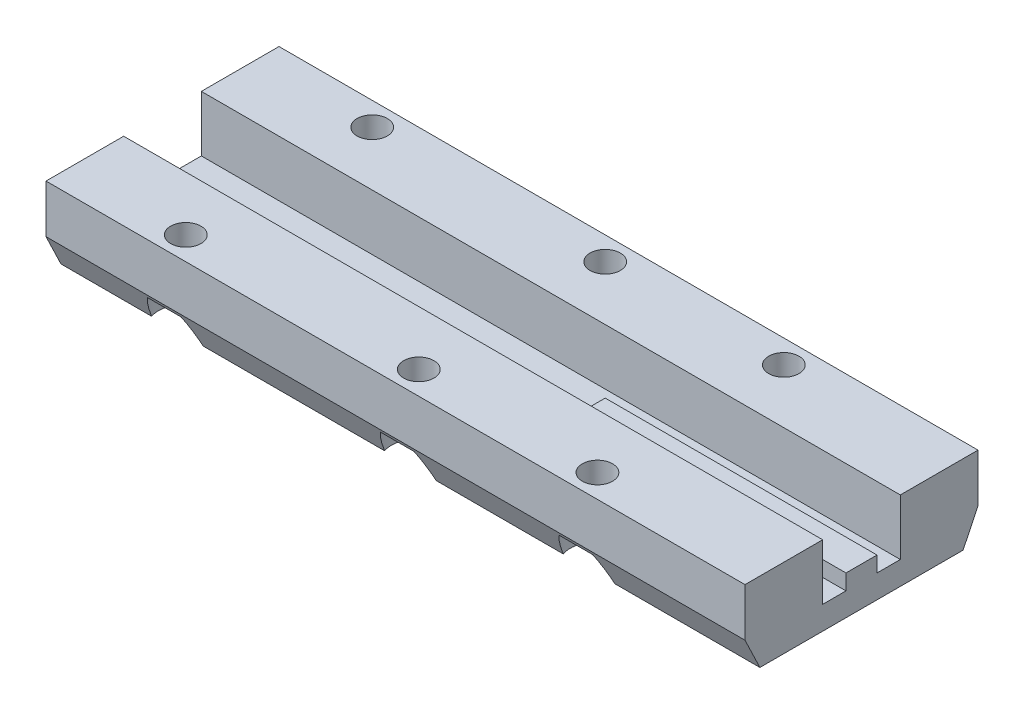
ISO-10303-21;
HEADER;
FILE_DESCRIPTION(('STEP AP214'),'2;1');
FILE_NAME('part.step','',(''),(''),'','','');
FILE_SCHEMA(('AUTOMOTIVE_DESIGN { 1 0 10303 214 1 1 1 1 }'));
ENDSEC;
DATA;
#1=APPLICATION_CONTEXT('core data for automotive mechanical design processes');
#2=APPLICATION_PROTOCOL_DEFINITION('international standard','automotive_design',2000,#1);
#3=PRODUCT_CONTEXT('',#1,'mechanical');
#4=PRODUCT('Part','Part','',(#3));
#5=PRODUCT_RELATED_PRODUCT_CATEGORY('part','',(#4));
#6=PRODUCT_DEFINITION_FORMATION('','',#4);
#7=PRODUCT_DEFINITION_CONTEXT('part definition',#1,'design');
#8=PRODUCT_DEFINITION('design','',#6,#7);
#9=PRODUCT_DEFINITION_SHAPE('','',#8);
#10=(LENGTH_UNIT() NAMED_UNIT(*) SI_UNIT(.MILLI.,.METRE.));
#11=(NAMED_UNIT(*) PLANE_ANGLE_UNIT() SI_UNIT($,.RADIAN.));
#12=(NAMED_UNIT(*) SI_UNIT($,.STERADIAN.) SOLID_ANGLE_UNIT());
#13=UNCERTAINTY_MEASURE_WITH_UNIT(LENGTH_MEASURE(1.E-05),#10,'distance_accuracy_value','');
#14=(GEOMETRIC_REPRESENTATION_CONTEXT(3) GLOBAL_UNCERTAINTY_ASSIGNED_CONTEXT((#13)) GLOBAL_UNIT_ASSIGNED_CONTEXT((#10,
#11,#12)) REPRESENTATION_CONTEXT('',''));
#15=CARTESIAN_POINT('',(0.,0.,0.));
#16=DIRECTION('',(0.,0.,1.));
#17=DIRECTION('',(1.,0.,0.));
#18=AXIS2_PLACEMENT_3D('',#15,#16,#17);
#19=CARTESIAN_POINT('',(15.,0.,12.));
#20=DIRECTION('',(0.,-1.,0.));
#21=DIRECTION('',(0.,0.,-1.));
#22=AXIS2_PLACEMENT_3D('',#19,#20,#21);
#23=CYLINDRICAL_SURFACE('',#22,1.95);
#24=CARTESIAN_POINT('',(15.,0.,12.));
#25=DIRECTION('',(0.,-1.,0.));
#26=DIRECTION('',(0.,0.,-1.));
#27=AXIS2_PLACEMENT_3D('',#24,#25,#26);
#28=CIRCLE('',#27,1.95);
#29=CARTESIAN_POINT('',(15.,0.,10.05));
#30=VERTEX_POINT('',#29);
#31=EDGE_CURVE('E439',#30,#30,#28,.T.);
#32=ORIENTED_EDGE('',*,*,#31,.F.);
#33=EDGE_LOOP('',(#32));
#34=FACE_BOUND('',#33,.T.);
#35=CARTESIAN_POINT('',(15.,-6.7,12.));
#36=DIRECTION('',(0.,-1.,0.));
#37=DIRECTION('',(0.,0.,-1.));
#38=AXIS2_PLACEMENT_3D('',#35,#36,#37);
#39=CIRCLE('',#38,1.95);
#40=CARTESIAN_POINT('',(15.,-6.7,10.05));
#41=VERTEX_POINT('',#40);
#42=EDGE_CURVE('E398',#41,#41,#39,.F.);
#43=ORIENTED_EDGE('',*,*,#42,.F.);
#44=EDGE_LOOP('',(#43));
#45=FACE_BOUND('',#44,.T.);
#46=ADVANCED_FACE('F33',(#34,#45),#23,.F.);
#47=CARTESIAN_POINT('',(68.,0.,12.));
#48=DIRECTION('',(0.,-1.,0.));
#49=DIRECTION('',(0.,0.,-1.));
#50=AXIS2_PLACEMENT_3D('',#47,#48,#49);
#51=CYLINDRICAL_SURFACE('',#50,1.95);
#52=CARTESIAN_POINT('',(68.,0.,12.));
#53=DIRECTION('',(0.,-1.,0.));
#54=DIRECTION('',(0.,0.,-1.));
#55=AXIS2_PLACEMENT_3D('',#52,#53,#54);
#56=CIRCLE('',#55,1.95);
#57=CARTESIAN_POINT('',(68.,0.,10.05));
#58=VERTEX_POINT('',#57);
#59=EDGE_CURVE('E443',#58,#58,#56,.T.);
#60=ORIENTED_EDGE('',*,*,#59,.F.);
#61=EDGE_LOOP('',(#60));
#62=FACE_BOUND('',#61,.T.);
#63=CARTESIAN_POINT('',(68.,-6.7,12.));
#64=DIRECTION('',(0.,-1.,0.));
#65=DIRECTION('',(0.,0.,-1.));
#66=AXIS2_PLACEMENT_3D('',#63,#64,#65);
#67=CIRCLE('',#66,1.95);
#68=CARTESIAN_POINT('',(68.,-6.7,10.05));
#69=VERTEX_POINT('',#68);
#70=EDGE_CURVE('E392',#69,#69,#67,.F.);
#71=ORIENTED_EDGE('',*,*,#70,.F.);
#72=EDGE_LOOP('',(#71));
#73=FACE_BOUND('',#72,.T.);
#74=ADVANCED_FACE('F566',(#62,#73),#51,.F.);
#75=CARTESIAN_POINT('',(45.,0.,12.));
#76=DIRECTION('',(0.,-1.,0.));
#77=DIRECTION('',(0.,0.,-1.));
#78=AXIS2_PLACEMENT_3D('',#75,#76,#77);
#79=CYLINDRICAL_SURFACE('',#78,1.95);
#80=CARTESIAN_POINT('',(45.,0.,12.));
#81=DIRECTION('',(0.,-1.,0.));
#82=DIRECTION('',(0.,0.,-1.));
#83=AXIS2_PLACEMENT_3D('',#80,#81,#82);
#84=CIRCLE('',#83,1.95);
#85=CARTESIAN_POINT('',(45.,0.,10.05));
#86=VERTEX_POINT('',#85);
#87=EDGE_CURVE('E446',#86,#86,#84,.T.);
#88=ORIENTED_EDGE('',*,*,#87,.F.);
#89=EDGE_LOOP('',(#88));
#90=FACE_BOUND('',#89,.T.);
#91=CARTESIAN_POINT('',(45.,-6.7,12.));
#92=DIRECTION('',(0.,-1.,0.));
#93=DIRECTION('',(0.,0.,-1.));
#94=AXIS2_PLACEMENT_3D('',#91,#92,#93);
#95=CIRCLE('',#94,1.95);
#96=CARTESIAN_POINT('',(45.,-6.7,10.05));
#97=VERTEX_POINT('',#96);
#98=EDGE_CURVE('E384',#97,#97,#95,.F.);
#99=ORIENTED_EDGE('',*,*,#98,.F.);
#100=EDGE_LOOP('',(#99));
#101=FACE_BOUND('',#100,.T.);
#102=ADVANCED_FACE('F572',(#90,#101),#79,.F.);
#103=CARTESIAN_POINT('',(68.,0.,-12.));
#104=DIRECTION('',(0.,-1.,0.));
#105=DIRECTION('',(0.,0.,-1.));
#106=AXIS2_PLACEMENT_3D('',#103,#104,#105);
#107=CYLINDRICAL_SURFACE('',#106,1.95);
#108=CARTESIAN_POINT('',(68.,0.,-12.));
#109=DIRECTION('',(0.,-1.,0.));
#110=DIRECTION('',(0.,0.,-1.));
#111=AXIS2_PLACEMENT_3D('',#108,#109,#110);
#112=CIRCLE('',#111,1.95);
#113=CARTESIAN_POINT('',(68.,0.,-13.95));
#114=VERTEX_POINT('',#113);
#115=EDGE_CURVE('E301',#114,#114,#112,.F.);
#116=ORIENTED_EDGE('',*,*,#115,.T.);
#117=EDGE_LOOP('',(#116));
#118=FACE_BOUND('',#117,.T.);
#119=CARTESIAN_POINT('',(68.,-6.7,-12.));
#120=DIRECTION('',(0.,-1.,0.));
#121=DIRECTION('',(0.,0.,-1.));
#122=AXIS2_PLACEMENT_3D('',#119,#120,#121);
#123=CIRCLE('',#122,1.95);
#124=CARTESIAN_POINT('',(68.,-6.7,-13.95));
#125=VERTEX_POINT('',#124);
#126=EDGE_CURVE('E379',#125,#125,#123,.T.);
#127=ORIENTED_EDGE('',*,*,#126,.T.);
#128=EDGE_LOOP('',(#127));
#129=FACE_BOUND('',#128,.T.);
#130=ADVANCED_FACE('F583',(#118,#129),#107,.F.);
#131=CARTESIAN_POINT('',(45.,0.,-12.));
#132=DIRECTION('',(0.,-1.,0.));
#133=DIRECTION('',(0.,0.,-1.));
#134=AXIS2_PLACEMENT_3D('',#131,#132,#133);
#135=CYLINDRICAL_SURFACE('',#134,1.95);
#136=CARTESIAN_POINT('',(45.,0.,-12.));
#137=DIRECTION('',(0.,-1.,0.));
#138=DIRECTION('',(0.,0.,-1.));
#139=AXIS2_PLACEMENT_3D('',#136,#137,#138);
#140=CIRCLE('',#139,1.95);
#141=CARTESIAN_POINT('',(45.,0.,-13.95));
#142=VERTEX_POINT('',#141);
#143=EDGE_CURVE('E305',#142,#142,#140,.F.);
#144=ORIENTED_EDGE('',*,*,#143,.T.);
#145=EDGE_LOOP('',(#144));
#146=FACE_BOUND('',#145,.T.);
#147=CARTESIAN_POINT('',(45.,-6.7,-12.));
#148=DIRECTION('',(0.,-1.,0.));
#149=DIRECTION('',(0.,0.,-1.));
#150=AXIS2_PLACEMENT_3D('',#147,#148,#149);
#151=CIRCLE('',#150,1.95);
#152=CARTESIAN_POINT('',(45.,-6.7,-13.95));
#153=VERTEX_POINT('',#152);
#154=EDGE_CURVE('E374',#153,#153,#151,.T.);
#155=ORIENTED_EDGE('',*,*,#154,.T.);
#156=EDGE_LOOP('',(#155));
#157=FACE_BOUND('',#156,.T.);
#158=ADVANCED_FACE('F619',(#146,#157),#135,.F.);
#159=CARTESIAN_POINT('',(15.,0.,-12.));
#160=DIRECTION('',(0.,-1.,0.));
#161=DIRECTION('',(0.,0.,-1.));
#162=AXIS2_PLACEMENT_3D('',#159,#160,#161);
#163=CYLINDRICAL_SURFACE('',#162,1.95);
#164=CARTESIAN_POINT('',(15.,0.,-12.));
#165=DIRECTION('',(0.,-1.,0.));
#166=DIRECTION('',(0.,0.,-1.));
#167=AXIS2_PLACEMENT_3D('',#164,#165,#166);
#168=CIRCLE('',#167,1.95);
#169=CARTESIAN_POINT('',(15.,0.,-13.95));
#170=VERTEX_POINT('',#169);
#171=EDGE_CURVE('E300',#170,#170,#168,.F.);
#172=ORIENTED_EDGE('',*,*,#171,.T.);
#173=EDGE_LOOP('',(#172));
#174=FACE_BOUND('',#173,.T.);
#175=CARTESIAN_POINT('',(15.,-6.7,-12.));
#176=DIRECTION('',(0.,-1.,0.));
#177=DIRECTION('',(0.,0.,-1.));
#178=AXIS2_PLACEMENT_3D('',#175,#176,#177);
#179=CIRCLE('',#178,1.95);
#180=CARTESIAN_POINT('',(15.,-6.7,-13.95));
#181=VERTEX_POINT('',#180);
#182=EDGE_CURVE('E369',#181,#181,#179,.T.);
#183=ORIENTED_EDGE('',*,*,#182,.T.);
#184=EDGE_LOOP('',(#183));
#185=FACE_BOUND('',#184,.T.);
#186=ADVANCED_FACE('F616',(#174,#185),#163,.F.);
#187=CARTESIAN_POINT('',(55.,-5.2,2.));
#188=DIRECTION('',(1.,0.,0.));
#189=DIRECTION('',(0.,0.,-1.));
#190=AXIS2_PLACEMENT_3D('',#187,#188,#189);
#191=PLANE('',#190);
#192=DIRECTION('',(0.,-1.,0.));
#193=VECTOR('',#192,1.);
#194=CARTESIAN_POINT('',(55.,-5.2,1.95));
#195=LINE('',#194,#193);
#196=CARTESIAN_POINT('',(55.,-7.2,1.95));
#197=VERTEX_POINT('',#196);
#198=CARTESIAN_POINT('',(55.,-10.2,1.95));
#199=VERTEX_POINT('',#198);
#200=EDGE_CURVE('E365',#197,#199,#195,.T.);
#201=ORIENTED_EDGE('',*,*,#200,.F.);
#202=DIRECTION('',(0.,0.,-1.));
#203=VECTOR('',#202,1.);
#204=CARTESIAN_POINT('',(55.,-7.2,2.));
#205=LINE('',#204,#203);
#206=CARTESIAN_POINT('',(55.,-7.2,2.));
#207=VERTEX_POINT('',#206);
#208=EDGE_CURVE('E266',#207,#197,#205,.T.);
#209=ORIENTED_EDGE('',*,*,#208,.F.);
#210=DIRECTION('',(0.,-1.,0.));
#211=VECTOR('',#210,1.);
#212=CARTESIAN_POINT('',(55.,-5.2,2.));
#213=LINE('',#212,#211);
#214=CARTESIAN_POINT('',(55.,-5.2,2.));
#215=VERTEX_POINT('',#214);
#216=EDGE_CURVE('E272',#215,#207,#213,.T.);
#217=ORIENTED_EDGE('',*,*,#216,.F.);
#218=DIRECTION('',(0.,0.,-1.));
#219=VECTOR('',#218,1.);
#220=CARTESIAN_POINT('',(55.,-5.2,2.));
#221=LINE('',#220,#219);
#222=CARTESIAN_POINT('',(55.,-5.2,-2.));
#223=VERTEX_POINT('',#222);
#224=EDGE_CURVE('E280',#215,#223,#221,.T.);
#225=ORIENTED_EDGE('',*,*,#224,.T.);
#226=DIRECTION('',(0.,-1.,0.));
#227=VECTOR('',#226,1.);
#228=CARTESIAN_POINT('',(55.,-5.2,-2.));
#229=LINE('',#228,#227);
#230=CARTESIAN_POINT('',(55.,-7.2,-2.));
#231=VERTEX_POINT('',#230);
#232=EDGE_CURVE('E271',#223,#231,#229,.T.);
#233=ORIENTED_EDGE('',*,*,#232,.T.);
#234=DIRECTION('',(0.,0.,1.));
#235=VECTOR('',#234,1.);
#236=CARTESIAN_POINT('',(55.,-7.2,-5.));
#237=LINE('',#236,#235);
#238=CARTESIAN_POINT('',(55.,-7.2,-1.95));
#239=VERTEX_POINT('',#238);
#240=EDGE_CURVE('E298',#231,#239,#237,.T.);
#241=ORIENTED_EDGE('',*,*,#240,.T.);
#242=DIRECTION('',(0.,-1.,0.));
#243=VECTOR('',#242,1.);
#244=CARTESIAN_POINT('',(55.,-7.2,-1.95));
#245=LINE('',#244,#243);
#246=CARTESIAN_POINT('',(55.,-10.2,-1.95));
#247=VERTEX_POINT('',#246);
#248=EDGE_CURVE('E295',#239,#247,#245,.T.);
#249=ORIENTED_EDGE('',*,*,#248,.T.);
#250=DIRECTION('',(0.,0.,-1.));
#251=VECTOR('',#250,1.);
#252=CARTESIAN_POINT('',(55.,-10.2,2.));
#253=LINE('',#252,#251);
#254=EDGE_CURVE('E291',#199,#247,#253,.T.);
#255=ORIENTED_EDGE('',*,*,#254,.F.);
#256=EDGE_LOOP('',(#201,#209,#217,#225,#233,#241,#249,#255));
#257=FACE_BOUND('',#256,.T.);
#258=ADVANCED_FACE('F515',(#257),#191,.F.);
#259=CARTESIAN_POINT('',(0.,0.,2.));
#260=DIRECTION('',(0.,0.,1.));
#261=DIRECTION('',(1.,0.,0.));
#262=AXIS2_PLACEMENT_3D('',#259,#260,#261);
#263=PLANE('',#262);
#264=ORIENTED_EDGE('',*,*,#216,.T.);
#265=DIRECTION('',(1.,0.,0.));
#266=VECTOR('',#265,1.);
#267=CARTESIAN_POINT('',(0.,-7.2,2.));
#268=LINE('',#267,#266);
#269=CARTESIAN_POINT('',(90.,-7.2,2.));
#270=VERTEX_POINT('',#269);
#271=EDGE_CURVE('E362',#207,#270,#268,.T.);
#272=ORIENTED_EDGE('',*,*,#271,.T.);
#273=DIRECTION('',(0.,1.,0.));
#274=VECTOR('',#273,1.);
#275=CARTESIAN_POINT('',(90.,-5.2,2.));
#276=LINE('',#275,#274);
#277=CARTESIAN_POINT('',(90.,-5.2,2.));
#278=VERTEX_POINT('',#277);
#279=EDGE_CURVE('E275',#270,#278,#276,.T.);
#280=ORIENTED_EDGE('',*,*,#279,.T.);
#281=DIRECTION('',(-1.,0.,0.));
#282=VECTOR('',#281,1.);
#283=CARTESIAN_POINT('',(55.,-5.2,2.));
#284=LINE('',#283,#282);
#285=EDGE_CURVE('E278',#278,#215,#284,.T.);
#286=ORIENTED_EDGE('',*,*,#285,.T.);
#287=EDGE_LOOP('',(#264,#272,#280,#286));
#288=FACE_BOUND('',#287,.T.);
#289=ADVANCED_FACE('F510',(#288),#263,.T.);
#290=CARTESIAN_POINT('',(90.,-7.2,-5.));
#291=DIRECTION('',(0.,-1.,0.));
#292=DIRECTION('',(0.,0.,-1.));
#293=AXIS2_PLACEMENT_3D('',#290,#291,#292);
#294=PLANE('',#293);
#295=ORIENTED_EDGE('',*,*,#240,.F.);
#296=DIRECTION('',(-1.,0.,0.));
#297=VECTOR('',#296,1.);
#298=CARTESIAN_POINT('',(90.,-7.2,-2.));
#299=LINE('',#298,#297);
#300=CARTESIAN_POINT('',(90.,-7.2,-2.));
#301=VERTEX_POINT('',#300);
#302=EDGE_CURVE('E293',#301,#231,#299,.T.);
#303=ORIENTED_EDGE('',*,*,#302,.F.);
#304=DIRECTION('',(0.,0.,1.));
#305=VECTOR('',#304,1.);
#306=CARTESIAN_POINT('',(90.,-7.2,-5.));
#307=LINE('',#306,#305);
#308=CARTESIAN_POINT('',(90.,-7.2,-5.));
#309=VERTEX_POINT('',#308);
#310=EDGE_CURVE('E318',#309,#301,#307,.T.);
#311=ORIENTED_EDGE('',*,*,#310,.F.);
#312=DIRECTION('',(-1.,0.,0.));
#313=VECTOR('',#312,1.);
#314=CARTESIAN_POINT('',(90.,-7.2,-5.));
#315=LINE('',#314,#313);
#316=CARTESIAN_POINT('',(0.,-7.2,-5.));
#317=VERTEX_POINT('',#316);
#318=EDGE_CURVE('E353',#309,#317,#315,.T.);
#319=ORIENTED_EDGE('',*,*,#318,.T.);
#320=DIRECTION('',(0.,0.,1.));
#321=VECTOR('',#320,1.);
#322=CARTESIAN_POINT('',(0.,-7.2,-5.));
#323=LINE('',#322,#321);
#324=CARTESIAN_POINT('',(0.,-7.2,-1.95));
#325=VERTEX_POINT('',#324);
#326=EDGE_CURVE('E332',#317,#325,#323,.T.);
#327=ORIENTED_EDGE('',*,*,#326,.T.);
#328=DIRECTION('',(-1.,0.,0.));
#329=VECTOR('',#328,1.);
#330=CARTESIAN_POINT('',(90.,-7.2,-1.95));
#331=LINE('',#330,#329);
#332=EDGE_CURVE('E351',#239,#325,#331,.T.);
#333=ORIENTED_EDGE('',*,*,#332,.F.);
#334=EDGE_LOOP('',(#295,#303,#311,#319,#327,#333));
#335=FACE_BOUND('',#334,.T.);
#336=ADVANCED_FACE('F606',(#335),#294,.F.);
#337=CARTESIAN_POINT('',(90.,-7.2,-1.95));
#338=DIRECTION('',(0.,0.,-1.));
#339=DIRECTION('',(0.,1.,0.));
#340=AXIS2_PLACEMENT_3D('',#337,#338,#339);
#341=PLANE('',#340);
#342=ORIENTED_EDGE('',*,*,#248,.F.);
#343=ORIENTED_EDGE('',*,*,#332,.T.);
#344=DIRECTION('',(0.,-1.,0.));
#345=VECTOR('',#344,1.);
#346=CARTESIAN_POINT('',(0.,-7.2,-1.95));
#347=LINE('',#346,#345);
#348=CARTESIAN_POINT('',(0.,-10.2,-1.95));
#349=VERTEX_POINT('',#348);
#350=EDGE_CURVE('E335',#325,#349,#347,.T.);
#351=ORIENTED_EDGE('',*,*,#350,.T.);
#352=DIRECTION('',(-1.,0.,0.));
#353=VECTOR('',#352,1.);
#354=CARTESIAN_POINT('',(90.,-10.2,-1.95));
#355=LINE('',#354,#353);
#356=EDGE_CURVE('E348',#247,#349,#355,.T.);
#357=ORIENTED_EDGE('',*,*,#356,.F.);
#358=EDGE_LOOP('',(#342,#343,#351,#357));
#359=FACE_BOUND('',#358,.T.);
#360=ADVANCED_FACE('F524',(#359),#341,.F.);
#361=CARTESIAN_POINT('',(90.,-10.2,-13.0811365520714));
#362=DIRECTION('',(0.,0.432522842970461,0.901622975699239));
#363=DIRECTION('',(0.,-0.901622975699239,0.432522842970461));
#364=AXIS2_PLACEMENT_3D('',#361,#362,#363);
#365=PLANE('',#364);
#366=DIRECTION('',(-1.,0.,0.));
#367=VECTOR('',#366,1.);
#368=CARTESIAN_POINT('',(90.,-10.2,-13.0811365520714));
#369=LINE('',#368,#367);
#370=CARTESIAN_POINT('',(90.,-10.2,-13.0811365520714));
#371=VERTEX_POINT('',#370);
#372=CARTESIAN_POINT('',(71.3288351950457,-10.2,-13.0811365520714));
#373=VERTEX_POINT('',#372);
#374=EDGE_CURVE('E345',#371,#373,#369,.T.);
#375=ORIENTED_EDGE('',*,*,#374,.T.);
#376=CARTESIAN_POINT('',(68.,-12.4537019051325,-12.));
#377=DIRECTION('',(0.,0.432522842970461,0.901622975699239));
#378=DIRECTION('',(0.,-0.901622975699239,0.432522842970461));
#379=AXIS2_PLACEMENT_3D('',#376,#377,#378);
#380=ELLIPSE('',#379,8.09205815804516,3.50000000000001);
#381=CARTESIAN_POINT('',(70.1521188998025,-6.7,-14.7601420690089));
#382=VERTEX_POINT('',#381);
#383=EDGE_CURVE('E420',#373,#382,#380,.T.);
#384=ORIENTED_EDGE('',*,*,#383,.T.);
#385=DIRECTION('',(1.,0.,0.));
#386=VECTOR('',#385,1.);
#387=CARTESIAN_POINT('',(90.,-6.7,-14.7601420690089));
#388=LINE('',#387,#386);
#389=CARTESIAN_POINT('',(65.8478811001975,-6.7,-14.7601420690089));
#390=VERTEX_POINT('',#389);
#391=EDGE_CURVE('E382',#390,#382,#388,.T.);
#392=ORIENTED_EDGE('',*,*,#391,.F.);
#393=CARTESIAN_POINT('',(64.6711648049543,-10.2,-13.0811365520714));
#394=VERTEX_POINT('',#393);
#395=EDGE_CURVE('E417',#390,#394,#380,.T.);
#396=ORIENTED_EDGE('',*,*,#395,.T.);
#397=CARTESIAN_POINT('',(48.3288351950457,-10.2,-13.0811365520714));
#398=VERTEX_POINT('',#397);
#399=EDGE_CURVE('E349',#394,#398,#369,.T.);
#400=ORIENTED_EDGE('',*,*,#399,.T.);
#401=CARTESIAN_POINT('',(45.,-12.4537019051325,-12.));
#402=DIRECTION('',(0.,0.432522842970461,0.901622975699239));
#403=DIRECTION('',(0.,-0.901622975699239,0.432522842970461));
#404=AXIS2_PLACEMENT_3D('',#401,#402,#403);
#405=ELLIPSE('',#404,8.09205815804514,3.5);
#406=CARTESIAN_POINT('',(47.1521188998025,-6.7,-14.7601420690089));
#407=VERTEX_POINT('',#406);
#408=EDGE_CURVE('E429',#398,#407,#405,.T.);
#409=ORIENTED_EDGE('',*,*,#408,.T.);
#410=DIRECTION('',(1.,0.,0.));
#411=VECTOR('',#410,1.);
#412=CARTESIAN_POINT('',(90.,-6.7,-14.7601420690089));
#413=LINE('',#412,#411);
#414=CARTESIAN_POINT('',(42.8478811001975,-6.7,-14.7601420690089));
#415=VERTEX_POINT('',#414);
#416=EDGE_CURVE('E377',#415,#407,#413,.T.);
#417=ORIENTED_EDGE('',*,*,#416,.F.);
#418=CARTESIAN_POINT('',(41.6711648049543,-10.2,-13.0811365520714));
#419=VERTEX_POINT('',#418);
#420=EDGE_CURVE('E426',#415,#419,#405,.T.);
#421=ORIENTED_EDGE('',*,*,#420,.T.);
#422=CARTESIAN_POINT('',(18.3288351950457,-10.2,-13.0811365520714));
#423=VERTEX_POINT('',#422);
#424=EDGE_CURVE('E676',#419,#423,#369,.T.);
#425=ORIENTED_EDGE('',*,*,#424,.T.);
#426=CARTESIAN_POINT('',(15.,-12.4537019051325,-12.));
#427=DIRECTION('',(0.,0.432522842970461,0.901622975699239));
#428=DIRECTION('',(0.,-0.901622975699239,0.432522842970461));
#429=AXIS2_PLACEMENT_3D('',#426,#427,#428);
#430=ELLIPSE('',#429,8.09205815804514,3.5);
#431=CARTESIAN_POINT('',(17.1521188998025,-6.7,-14.7601420690089));
#432=VERTEX_POINT('',#431);
#433=EDGE_CURVE('E438',#423,#432,#430,.T.);
#434=ORIENTED_EDGE('',*,*,#433,.T.);
#435=DIRECTION('',(1.,0.,0.));
#436=VECTOR('',#435,1.);
#437=CARTESIAN_POINT('',(90.,-6.7,-14.7601420690089));
#438=LINE('',#437,#436);
#439=CARTESIAN_POINT('',(12.8478811001975,-6.7,-14.7601420690089));
#440=VERTEX_POINT('',#439);
#441=EDGE_CURVE('E372',#440,#432,#438,.T.);
#442=ORIENTED_EDGE('',*,*,#441,.F.);
#443=CARTESIAN_POINT('',(11.6711648049543,-10.2,-13.0811365520714));
#444=VERTEX_POINT('',#443);
#445=EDGE_CURVE('E435',#440,#444,#430,.T.);
#446=ORIENTED_EDGE('',*,*,#445,.T.);
#447=CARTESIAN_POINT('',(0.,-10.2,-13.0811365520714));
#448=VERTEX_POINT('',#447);
#449=EDGE_CURVE('E344',#444,#448,#369,.T.);
#450=ORIENTED_EDGE('',*,*,#449,.T.);
#451=DIRECTION('',(0.,0.901622975699239,-0.432522842970461));
#452=VECTOR('',#451,1.);
#453=CARTESIAN_POINT('',(0.,-10.2,-13.0811365520714));
#454=LINE('',#453,#452);
#455=CARTESIAN_POINT('',(0.,-6.2,-15.));
#456=VERTEX_POINT('',#455);
#457=EDGE_CURVE('E314',#448,#456,#454,.T.);
#458=ORIENTED_EDGE('',*,*,#457,.T.);
#459=DIRECTION('',(-1.,0.,0.));
#460=VECTOR('',#459,1.);
#461=CARTESIAN_POINT('',(90.,-6.2,-15.));
#462=LINE('',#461,#460);
#463=CARTESIAN_POINT('',(90.,-6.2,-15.));
#464=VERTEX_POINT('',#463);
#465=EDGE_CURVE('E325',#464,#456,#462,.T.);
#466=ORIENTED_EDGE('',*,*,#465,.F.);
#467=DIRECTION('',(0.,0.901622975699239,-0.432522842970461));
#468=VECTOR('',#467,1.);
#469=CARTESIAN_POINT('',(90.,-10.2,-13.0811365520714));
#470=LINE('',#469,#468);
#471=EDGE_CURVE('E323',#371,#464,#470,.T.);
#472=ORIENTED_EDGE('',*,*,#471,.F.);
#473=EDGE_LOOP('',(#375,#384,#392,#396,#400,#409,#417,#421,#425,#434,#442,#446,#450,#458,#466,#472));
#474=FACE_BOUND('',#473,.T.);
#475=ADVANCED_FACE('F532',(#474),#365,.F.);
#476=CARTESIAN_POINT('',(90.,0.,-15.));
#477=DIRECTION('',(0.,0.,1.));
#478=DIRECTION('',(1.,0.,0.));
#479=AXIS2_PLACEMENT_3D('',#476,#477,#478);
#480=PLANE('',#479);
#481=DIRECTION('',(0.,1.,0.));
#482=VECTOR('',#481,1.);
#483=CARTESIAN_POINT('',(0.,0.,-15.));
#484=LINE('',#483,#482);
#485=CARTESIAN_POINT('',(0.,0.,-15.));
#486=VERTEX_POINT('',#485);
#487=EDGE_CURVE('E304',#456,#486,#484,.T.);
#488=ORIENTED_EDGE('',*,*,#487,.T.);
#489=DIRECTION('',(-1.,0.,0.));
#490=VECTOR('',#489,1.);
#491=CARTESIAN_POINT('',(90.,0.,-15.));
#492=LINE('',#491,#490);
#493=CARTESIAN_POINT('',(90.,0.,-15.));
#494=VERTEX_POINT('',#493);
#495=EDGE_CURVE('E359',#494,#486,#492,.T.);
#496=ORIENTED_EDGE('',*,*,#495,.F.);
#497=DIRECTION('',(0.,1.,0.));
#498=VECTOR('',#497,1.);
#499=CARTESIAN_POINT('',(90.,0.,-15.));
#500=LINE('',#499,#498);
#501=EDGE_CURVE('E310',#464,#494,#500,.T.);
#502=ORIENTED_EDGE('',*,*,#501,.F.);
#503=ORIENTED_EDGE('',*,*,#465,.T.);
#504=EDGE_LOOP('',(#488,#496,#502,#503));
#505=FACE_BOUND('',#504,.T.);
#506=ADVANCED_FACE('F35',(#505),#480,.F.);
#507=CARTESIAN_POINT('',(90.,0.,-15.));
#508=DIRECTION('',(0.,-1.,0.));
#509=DIRECTION('',(0.,0.,-1.));
#510=AXIS2_PLACEMENT_3D('',#507,#508,#509);
#511=PLANE('',#510);
#512=ORIENTED_EDGE('',*,*,#115,.F.);
#513=EDGE_LOOP('',(#512));
#514=FACE_BOUND('',#513,.T.);
#515=ORIENTED_EDGE('',*,*,#143,.F.);
#516=EDGE_LOOP('',(#515));
#517=FACE_BOUND('',#516,.T.);
#518=ORIENTED_EDGE('',*,*,#171,.F.);
#519=EDGE_LOOP('',(#518));
#520=FACE_BOUND('',#519,.T.);
#521=DIRECTION('',(0.,0.,1.));
#522=VECTOR('',#521,1.);
#523=CARTESIAN_POINT('',(0.,0.,-15.));
#524=LINE('',#523,#522);
#525=CARTESIAN_POINT('',(0.,0.,-5.));
#526=VERTEX_POINT('',#525);
#527=EDGE_CURVE('E328',#486,#526,#524,.T.);
#528=ORIENTED_EDGE('',*,*,#527,.T.);
#529=DIRECTION('',(-1.,0.,0.));
#530=VECTOR('',#529,1.);
#531=CARTESIAN_POINT('',(90.,0.,-5.));
#532=LINE('',#531,#530);
#533=CARTESIAN_POINT('',(90.,0.,-5.));
#534=VERTEX_POINT('',#533);
#535=EDGE_CURVE('E356',#534,#526,#532,.T.);
#536=ORIENTED_EDGE('',*,*,#535,.F.);
#537=DIRECTION('',(0.,0.,1.));
#538=VECTOR('',#537,1.);
#539=CARTESIAN_POINT('',(90.,0.,-15.));
#540=LINE('',#539,#538);
#541=EDGE_CURVE('E313',#494,#534,#540,.T.);
#542=ORIENTED_EDGE('',*,*,#541,.F.);
#543=ORIENTED_EDGE('',*,*,#495,.T.);
#544=EDGE_LOOP('',(#528,#536,#542,#543));
#545=FACE_BOUND('',#544,.T.);
#546=ADVANCED_FACE('F642',(#514,#517,#520,#545),#511,.F.);
#547=CARTESIAN_POINT('',(90.,0.,-5.));
#548=DIRECTION('',(0.,0.,-1.));
#549=DIRECTION('',(0.,1.,0.));
#550=AXIS2_PLACEMENT_3D('',#547,#548,#549);
#551=PLANE('',#550);
#552=DIRECTION('',(0.,-1.,0.));
#553=VECTOR('',#552,1.);
#554=CARTESIAN_POINT('',(0.,0.,-5.));
#555=LINE('',#554,#553);
#556=EDGE_CURVE('E330',#526,#317,#555,.T.);
#557=ORIENTED_EDGE('',*,*,#556,.T.);
#558=ORIENTED_EDGE('',*,*,#318,.F.);
#559=DIRECTION('',(0.,-1.,0.));
#560=VECTOR('',#559,1.);
#561=CARTESIAN_POINT('',(90.,0.,-5.));
#562=LINE('',#561,#560);
#563=EDGE_CURVE('E316',#534,#309,#562,.T.);
#564=ORIENTED_EDGE('',*,*,#563,.F.);
#565=ORIENTED_EDGE('',*,*,#535,.T.);
#566=EDGE_LOOP('',(#557,#558,#564,#565));
#567=FACE_BOUND('',#566,.T.);
#568=ADVANCED_FACE('F635',(#567),#551,.F.);
#569=CARTESIAN_POINT('',(90.,-10.2,-1.95));
#570=DIRECTION('',(0.,1.,0.));
#571=DIRECTION('',(0.,0.,1.));
#572=AXIS2_PLACEMENT_3D('',#569,#570,#571);
#573=PLANE('',#572);
#574=DIRECTION('',(-1.,0.,0.));
#575=VECTOR('',#574,1.);
#576=CARTESIAN_POINT('',(90.,-10.2,13.0811365520714));
#577=LINE('',#576,#575);
#578=CARTESIAN_POINT('',(41.6711648049543,-10.2,13.0811365520714));
#579=VERTEX_POINT('',#578);
#580=CARTESIAN_POINT('',(18.3288351950457,-10.2,13.0811365520714));
#581=VERTEX_POINT('',#580);
#582=EDGE_CURVE('E241',#579,#581,#577,.T.);
#583=ORIENTED_EDGE('',*,*,#582,.T.);
#584=CARTESIAN_POINT('',(15.,-10.2,12.));
#585=DIRECTION('',(0.,-1.,0.));
#586=DIRECTION('',(0.,0.,-1.));
#587=AXIS2_PLACEMENT_3D('',#584,#585,#586);
#588=CIRCLE('',#587,3.5);
#589=CARTESIAN_POINT('',(11.6711648049543,-10.2,13.0811365520714));
#590=VERTEX_POINT('',#589);
#591=EDGE_CURVE('E229',#590,#581,#588,.T.);
#592=ORIENTED_EDGE('',*,*,#591,.F.);
#593=CARTESIAN_POINT('',(0.,-10.2,13.0811365520714));
#594=VERTEX_POINT('',#593);
#595=EDGE_CURVE('E249',#590,#594,#577,.T.);
#596=ORIENTED_EDGE('',*,*,#595,.T.);
#597=DIRECTION('',(0.,0.,-1.));
#598=VECTOR('',#597,1.);
#599=CARTESIAN_POINT('',(0.,-10.2,1.95));
#600=LINE('',#599,#598);
#601=CARTESIAN_POINT('',(0.,-10.2,1.95));
#602=VERTEX_POINT('',#601);
#603=EDGE_CURVE('E469',#594,#602,#600,.T.);
#604=ORIENTED_EDGE('',*,*,#603,.T.);
#605=DIRECTION('',(-1.,0.,0.));
#606=VECTOR('',#605,1.);
#607=CARTESIAN_POINT('',(90.,-10.2,1.95));
#608=LINE('',#607,#606);
#609=EDGE_CURVE('E252',#199,#602,#608,.T.);
#610=ORIENTED_EDGE('',*,*,#609,.F.);
#611=ORIENTED_EDGE('',*,*,#254,.T.);
#612=ORIENTED_EDGE('',*,*,#356,.T.);
#613=DIRECTION('',(0.,0.,-1.));
#614=VECTOR('',#613,1.);
#615=CARTESIAN_POINT('',(0.,-10.2,-1.95));
#616=LINE('',#615,#614);
#617=EDGE_CURVE('E338',#349,#448,#616,.T.);
#618=ORIENTED_EDGE('',*,*,#617,.T.);
#619=ORIENTED_EDGE('',*,*,#449,.F.);
#620=CARTESIAN_POINT('',(15.,-10.2,-12.));
#621=DIRECTION('',(0.,-1.,0.));
#622=DIRECTION('',(0.,0.,-1.));
#623=AXIS2_PLACEMENT_3D('',#620,#621,#622);
#624=CIRCLE('',#623,3.5);
#625=EDGE_CURVE('E432',#423,#444,#624,.T.);
#626=ORIENTED_EDGE('',*,*,#625,.F.);
#627=ORIENTED_EDGE('',*,*,#424,.F.);
#628=CARTESIAN_POINT('',(45.,-10.2,-12.));
#629=DIRECTION('',(0.,-1.,0.));
#630=DIRECTION('',(0.,0.,-1.));
#631=AXIS2_PLACEMENT_3D('',#628,#629,#630);
#632=CIRCLE('',#631,3.5);
#633=EDGE_CURVE('E423',#398,#419,#632,.T.);
#634=ORIENTED_EDGE('',*,*,#633,.F.);
#635=ORIENTED_EDGE('',*,*,#399,.F.);
#636=CARTESIAN_POINT('',(68.,-10.2,-12.));
#637=DIRECTION('',(0.,-1.,0.));
#638=DIRECTION('',(0.,0.,-1.));
#639=AXIS2_PLACEMENT_3D('',#636,#637,#638);
#640=CIRCLE('',#639,3.50000000000001);
#641=EDGE_CURVE('E412',#373,#394,#640,.T.);
#642=ORIENTED_EDGE('',*,*,#641,.F.);
#643=ORIENTED_EDGE('',*,*,#374,.F.);
#644=DIRECTION('',(0.,0.,-1.));
#645=VECTOR('',#644,1.);
#646=CARTESIAN_POINT('',(90.,-10.2,-1.95));
#647=LINE('',#646,#645);
#648=CARTESIAN_POINT('',(90.,-10.2,13.0811365520714));
#649=VERTEX_POINT('',#648);
#650=EDGE_CURVE('E321',#649,#371,#647,.T.);
#651=ORIENTED_EDGE('',*,*,#650,.F.);
#652=CARTESIAN_POINT('',(71.3288351950457,-10.2,13.0811365520714));
#653=VERTEX_POINT('',#652);
#654=EDGE_CURVE('E251',#649,#653,#577,.T.);
#655=ORIENTED_EDGE('',*,*,#654,.T.);
#656=CARTESIAN_POINT('',(68.,-10.2,12.));
#657=DIRECTION('',(0.,-1.,0.));
#658=DIRECTION('',(0.,0.,-1.));
#659=AXIS2_PLACEMENT_3D('',#656,#657,#658);
#660=CIRCLE('',#659,3.50000000000001);
#661=CARTESIAN_POINT('',(64.6711648049543,-10.2,13.0811365520714));
#662=VERTEX_POINT('',#661);
#663=EDGE_CURVE('E402',#662,#653,#660,.T.);
#664=ORIENTED_EDGE('',*,*,#663,.F.);
#665=CARTESIAN_POINT('',(48.3288351950457,-10.2,13.0811365520714));
#666=VERTEX_POINT('',#665);
#667=EDGE_CURVE('E248',#662,#666,#577,.T.);
#668=ORIENTED_EDGE('',*,*,#667,.T.);
#669=CARTESIAN_POINT('',(45.,-10.2,12.));
#670=DIRECTION('',(0.,-1.,0.));
#671=DIRECTION('',(0.,0.,-1.));
#672=AXIS2_PLACEMENT_3D('',#669,#670,#671);
#673=CIRCLE('',#672,3.5);
#674=EDGE_CURVE('E247',#579,#666,#673,.T.);
#675=ORIENTED_EDGE('',*,*,#674,.F.);
#676=EDGE_LOOP('',(#583,#592,#596,#604,#610,#611,#612,#618,#619,#626,#627,#634,#635,#642,#643,
#651,#655,#664,#668,#675));
#677=FACE_BOUND('',#676,.T.);
#678=ADVANCED_FACE('F245',(#677),#573,.F.);
#679=CARTESIAN_POINT('',(90.,0.,0.));
#680=DIRECTION('',(1.,0.,0.));
#681=DIRECTION('',(0.,0.,-1.));
#682=AXIS2_PLACEMENT_3D('',#679,#680,#681);
#683=PLANE('',#682);
#684=ORIENTED_EDGE('',*,*,#650,.T.);
#685=ORIENTED_EDGE('',*,*,#471,.T.);
#686=ORIENTED_EDGE('',*,*,#501,.T.);
#687=ORIENTED_EDGE('',*,*,#541,.T.);
#688=ORIENTED_EDGE('',*,*,#563,.T.);
#689=ORIENTED_EDGE('',*,*,#310,.T.);
#690=DIRECTION('',(0.,1.,0.));
#691=VECTOR('',#690,1.);
#692=CARTESIAN_POINT('',(90.,-5.2,-2.));
#693=LINE('',#692,#691);
#694=CARTESIAN_POINT('',(90.,-5.2,-2.));
#695=VERTEX_POINT('',#694);
#696=EDGE_CURVE('E283',#301,#695,#693,.T.);
#697=ORIENTED_EDGE('',*,*,#696,.T.);
#698=DIRECTION('',(0.,0.,-1.));
#699=VECTOR('',#698,1.);
#700=CARTESIAN_POINT('',(90.,-5.2,2.));
#701=LINE('',#700,#699);
#702=EDGE_CURVE('E288',#278,#695,#701,.T.);
#703=ORIENTED_EDGE('',*,*,#702,.F.);
#704=ORIENTED_EDGE('',*,*,#279,.F.);
#705=DIRECTION('',(0.,0.,1.));
#706=VECTOR('',#705,1.);
#707=CARTESIAN_POINT('',(90.,-7.2,5.));
#708=LINE('',#707,#706);
#709=CARTESIAN_POINT('',(90.,-7.2,5.));
#710=VERTEX_POINT('',#709);
#711=EDGE_CURVE('E458',#270,#710,#708,.T.);
#712=ORIENTED_EDGE('',*,*,#711,.T.);
#713=DIRECTION('',(0.,1.,0.));
#714=VECTOR('',#713,1.);
#715=CARTESIAN_POINT('',(90.,0.,5.));
#716=LINE('',#715,#714);
#717=CARTESIAN_POINT('',(90.,0.,5.));
#718=VERTEX_POINT('',#717);
#719=EDGE_CURVE('E460',#710,#718,#716,.T.);
#720=ORIENTED_EDGE('',*,*,#719,.T.);
#721=DIRECTION('',(0.,0.,1.));
#722=VECTOR('',#721,1.);
#723=CARTESIAN_POINT('',(90.,0.,15.));
#724=LINE('',#723,#722);
#725=CARTESIAN_POINT('',(90.,0.,15.));
#726=VERTEX_POINT('',#725);
#727=EDGE_CURVE('E449',#718,#726,#724,.T.);
#728=ORIENTED_EDGE('',*,*,#727,.T.);
#729=DIRECTION('',(0.,-1.,0.));
#730=VECTOR('',#729,1.);
#731=CARTESIAN_POINT('',(90.,0.,15.));
#732=LINE('',#731,#730);
#733=CARTESIAN_POINT('',(90.,-6.2,15.));
#734=VERTEX_POINT('',#733);
#735=EDGE_CURVE('E452',#726,#734,#732,.T.);
#736=ORIENTED_EDGE('',*,*,#735,.T.);
#737=DIRECTION('',(0.,-0.901622975699238,-0.432522842970462));
#738=VECTOR('',#737,1.);
#739=CARTESIAN_POINT('',(90.,-10.2,13.0811365520714));
#740=LINE('',#739,#738);
#741=EDGE_CURVE('E455',#734,#649,#740,.T.);
#742=ORIENTED_EDGE('',*,*,#741,.T.);
#743=EDGE_LOOP('',(#684,#685,#686,#687,#688,#689,#697,#703,#704,#712,#720,#728,#736,#742));
#744=FACE_BOUND('',#743,.T.);
#745=ADVANCED_FACE('F506',(#744),#683,.T.);
#746=CARTESIAN_POINT('',(0.,0.,0.));
#747=DIRECTION('',(1.,0.,0.));
#748=DIRECTION('',(0.,0.,-1.));
#749=AXIS2_PLACEMENT_3D('',#746,#747,#748);
#750=PLANE('',#749);
#751=ORIENTED_EDGE('',*,*,#487,.F.);
#752=ORIENTED_EDGE('',*,*,#457,.F.);
#753=ORIENTED_EDGE('',*,*,#617,.F.);
#754=ORIENTED_EDGE('',*,*,#350,.F.);
#755=ORIENTED_EDGE('',*,*,#326,.F.);
#756=ORIENTED_EDGE('',*,*,#556,.F.);
#757=ORIENTED_EDGE('',*,*,#527,.F.);
#758=EDGE_LOOP('',(#751,#752,#753,#754,#755,#756,#757));
#759=FACE_BOUND('',#758,.T.);
#760=ADVANCED_FACE('F529',(#759),#750,.F.);
#761=CARTESIAN_POINT('',(0.,0.,-2.));
#762=DIRECTION('',(0.,0.,1.));
#763=DIRECTION('',(1.,0.,0.));
#764=AXIS2_PLACEMENT_3D('',#761,#762,#763);
#765=PLANE('',#764);
#766=ORIENTED_EDGE('',*,*,#696,.F.);
#767=ORIENTED_EDGE('',*,*,#302,.T.);
#768=ORIENTED_EDGE('',*,*,#232,.F.);
#769=DIRECTION('',(-1.,0.,0.));
#770=VECTOR('',#769,1.);
#771=CARTESIAN_POINT('',(55.,-5.2,-2.));
#772=LINE('',#771,#770);
#773=EDGE_CURVE('E276',#695,#223,#772,.T.);
#774=ORIENTED_EDGE('',*,*,#773,.F.);
#775=EDGE_LOOP('',(#766,#767,#768,#774));
#776=FACE_BOUND('',#775,.T.);
#777=ADVANCED_FACE('F607',(#776),#765,.F.);
#778=CARTESIAN_POINT('',(55.,-5.2,2.));
#779=DIRECTION('',(0.,-1.,0.));
#780=DIRECTION('',(0.,0.,-1.));
#781=AXIS2_PLACEMENT_3D('',#778,#779,#780);
#782=PLANE('',#781);
#783=ORIENTED_EDGE('',*,*,#773,.T.);
#784=ORIENTED_EDGE('',*,*,#224,.F.);
#785=ORIENTED_EDGE('',*,*,#285,.F.);
#786=ORIENTED_EDGE('',*,*,#702,.T.);
#787=EDGE_LOOP('',(#783,#784,#785,#786));
#788=FACE_BOUND('',#787,.T.);
#789=ADVANCED_FACE('F594',(#788),#782,.F.);
#790=CARTESIAN_POINT('',(90.,-7.2,1.95));
#791=DIRECTION('',(0.,0.,1.));
#792=DIRECTION('',(0.,-1.,0.));
#793=AXIS2_PLACEMENT_3D('',#790,#791,#792);
#794=PLANE('',#793);
#795=DIRECTION('',(-1.,0.,0.));
#796=VECTOR('',#795,1.);
#797=CARTESIAN_POINT('',(90.,-7.2,1.95));
#798=LINE('',#797,#796);
#799=CARTESIAN_POINT('',(0.,-7.2,1.95));
#800=VERTEX_POINT('',#799);
#801=EDGE_CURVE('E483',#197,#800,#798,.T.);
#802=ORIENTED_EDGE('',*,*,#801,.F.);
#803=ORIENTED_EDGE('',*,*,#200,.T.);
#804=ORIENTED_EDGE('',*,*,#609,.T.);
#805=DIRECTION('',(0.,1.,0.));
#806=VECTOR('',#805,1.);
#807=CARTESIAN_POINT('',(0.,-7.2,1.95));
#808=LINE('',#807,#806);
#809=EDGE_CURVE('E472',#602,#800,#808,.T.);
#810=ORIENTED_EDGE('',*,*,#809,.T.);
#811=EDGE_LOOP('',(#802,#803,#804,#810));
#812=FACE_BOUND('',#811,.T.);
#813=ADVANCED_FACE('F487',(#812),#794,.F.);
#814=CARTESIAN_POINT('',(90.,-7.2,5.));
#815=DIRECTION('',(0.,-1.,0.));
#816=DIRECTION('',(0.,0.,-1.));
#817=AXIS2_PLACEMENT_3D('',#814,#815,#816);
#818=PLANE('',#817);
#819=ORIENTED_EDGE('',*,*,#271,.F.);
#820=ORIENTED_EDGE('',*,*,#208,.T.);
#821=ORIENTED_EDGE('',*,*,#801,.T.);
#822=DIRECTION('',(0.,0.,1.));
#823=VECTOR('',#822,1.);
#824=CARTESIAN_POINT('',(0.,-7.2,5.));
#825=LINE('',#824,#823);
#826=CARTESIAN_POINT('',(0.,-7.2,5.));
#827=VERTEX_POINT('',#826);
#828=EDGE_CURVE('E475',#800,#827,#825,.T.);
#829=ORIENTED_EDGE('',*,*,#828,.T.);
#830=DIRECTION('',(-1.,0.,0.));
#831=VECTOR('',#830,1.);
#832=CARTESIAN_POINT('',(90.,-7.2,5.));
#833=LINE('',#832,#831);
#834=EDGE_CURVE('E480',#710,#827,#833,.T.);
#835=ORIENTED_EDGE('',*,*,#834,.F.);
#836=ORIENTED_EDGE('',*,*,#711,.F.);
#837=EDGE_LOOP('',(#819,#820,#821,#829,#835,#836));
#838=FACE_BOUND('',#837,.T.);
#839=ADVANCED_FACE('F498',(#838),#818,.F.);
#840=CARTESIAN_POINT('',(90.,0.,15.));
#841=DIRECTION('',(0.,-1.,0.));
#842=DIRECTION('',(0.,0.,-1.));
#843=AXIS2_PLACEMENT_3D('',#840,#841,#842);
#844=PLANE('',#843);
#845=ORIENTED_EDGE('',*,*,#31,.T.);
#846=EDGE_LOOP('',(#845));
#847=FACE_BOUND('',#846,.T.);
#848=ORIENTED_EDGE('',*,*,#59,.T.);
#849=EDGE_LOOP('',(#848));
#850=FACE_BOUND('',#849,.T.);
#851=ORIENTED_EDGE('',*,*,#87,.T.);
#852=EDGE_LOOP('',(#851));
#853=FACE_BOUND('',#852,.T.);
#854=DIRECTION('',(0.,0.,1.));
#855=VECTOR('',#854,1.);
#856=CARTESIAN_POINT('',(0.,0.,15.));
#857=LINE('',#856,#855);
#858=CARTESIAN_POINT('',(0.,0.,5.));
#859=VERTEX_POINT('',#858);
#860=CARTESIAN_POINT('',(0.,0.,15.));
#861=VERTEX_POINT('',#860);
#862=EDGE_CURVE('E442',#859,#861,#857,.T.);
#863=ORIENTED_EDGE('',*,*,#862,.T.);
#864=DIRECTION('',(-1.,0.,0.));
#865=VECTOR('',#864,1.);
#866=CARTESIAN_POINT('',(90.,0.,15.));
#867=LINE('',#866,#865);
#868=EDGE_CURVE('E260',#726,#861,#867,.T.);
#869=ORIENTED_EDGE('',*,*,#868,.F.);
#870=ORIENTED_EDGE('',*,*,#727,.F.);
#871=DIRECTION('',(-1.,0.,0.));
#872=VECTOR('',#871,1.);
#873=CARTESIAN_POINT('',(90.,0.,5.));
#874=LINE('',#873,#872);
#875=EDGE_CURVE('E462',#718,#859,#874,.T.);
#876=ORIENTED_EDGE('',*,*,#875,.T.);
#877=EDGE_LOOP('',(#863,#869,#870,#876));
#878=FACE_BOUND('',#877,.T.);
#879=ADVANCED_FACE('F591',(#847,#850,#853,#878),#844,.F.);
#880=CARTESIAN_POINT('',(90.,0.,15.));
#881=DIRECTION('',(0.,0.,-1.));
#882=DIRECTION('',(-1.,0.,0.));
#883=AXIS2_PLACEMENT_3D('',#880,#881,#882);
#884=PLANE('',#883);
#885=DIRECTION('',(0.,-1.,0.));
#886=VECTOR('',#885,1.);
#887=CARTESIAN_POINT('',(0.,0.,15.));
#888=LINE('',#887,#886);
#889=CARTESIAN_POINT('',(0.,-6.2,15.));
#890=VERTEX_POINT('',#889);
#891=EDGE_CURVE('E465',#861,#890,#888,.T.);
#892=ORIENTED_EDGE('',*,*,#891,.T.);
#893=DIRECTION('',(-1.,0.,0.));
#894=VECTOR('',#893,1.);
#895=CARTESIAN_POINT('',(90.,-6.2,15.));
#896=LINE('',#895,#894);
#897=EDGE_CURVE('E256',#734,#890,#896,.T.);
#898=ORIENTED_EDGE('',*,*,#897,.F.);
#899=ORIENTED_EDGE('',*,*,#735,.F.);
#900=ORIENTED_EDGE('',*,*,#868,.T.);
#901=EDGE_LOOP('',(#892,#898,#899,#900));
#902=FACE_BOUND('',#901,.T.);
#903=ADVANCED_FACE('F597',(#902),#884,.F.);
#904=CARTESIAN_POINT('',(90.,-10.2,13.0811365520714));
#905=DIRECTION('',(0.,0.432522842970462,-0.901622975699238));
#906=DIRECTION('',(0.,0.901622975699238,0.432522842970462));
#907=AXIS2_PLACEMENT_3D('',#904,#905,#906);
#908=PLANE('',#907);
#909=ORIENTED_EDGE('',*,*,#595,.F.);
#910=CARTESIAN_POINT('',(15.,-12.4537019051325,12.));
#911=DIRECTION('',(0.,0.432522842970462,-0.901622975699238));
#912=DIRECTION('',(0.,-0.901622975699238,-0.432522842970462));
#913=AXIS2_PLACEMENT_3D('',#910,#911,#912);
#914=ELLIPSE('',#913,8.09205815804514,3.5);
#915=CARTESIAN_POINT('',(12.8478811001975,-6.7,14.7601420690089));
#916=VERTEX_POINT('',#915);
#917=EDGE_CURVE('E11',#590,#916,#914,.T.);
#918=ORIENTED_EDGE('',*,*,#917,.T.);
#919=DIRECTION('',(-1.,0.,0.));
#920=VECTOR('',#919,1.);
#921=CARTESIAN_POINT('',(90.,-6.7,14.7601420690089));
#922=LINE('',#921,#920);
#923=CARTESIAN_POINT('',(17.1521188998025,-6.7,14.7601420690089));
#924=VERTEX_POINT('',#923);
#925=EDGE_CURVE('E242',#924,#916,#922,.T.);
#926=ORIENTED_EDGE('',*,*,#925,.F.);
#927=EDGE_CURVE('E37',#924,#581,#914,.T.);
#928=ORIENTED_EDGE('',*,*,#927,.T.);
#929=ORIENTED_EDGE('',*,*,#582,.F.);
#930=CARTESIAN_POINT('',(45.,-12.4537019051325,12.));
#931=DIRECTION('',(0.,0.432522842970462,-0.901622975699238));
#932=DIRECTION('',(0.,-0.901622975699238,-0.432522842970462));
#933=AXIS2_PLACEMENT_3D('',#930,#931,#932);
#934=ELLIPSE('',#933,8.09205815804514,3.5);
#935=CARTESIAN_POINT('',(42.8478811001975,-6.7,14.7601420690089));
#936=VERTEX_POINT('',#935);
#937=EDGE_CURVE('E391',#579,#936,#934,.T.);
#938=ORIENTED_EDGE('',*,*,#937,.T.);
#939=DIRECTION('',(-1.,0.,0.));
#940=VECTOR('',#939,1.);
#941=CARTESIAN_POINT('',(90.,-6.7,14.7601420690089));
#942=LINE('',#941,#940);
#943=CARTESIAN_POINT('',(47.1521188998025,-6.7,14.7601420690089));
#944=VERTEX_POINT('',#943);
#945=EDGE_CURVE('E387',#944,#936,#942,.T.);
#946=ORIENTED_EDGE('',*,*,#945,.F.);
#947=EDGE_CURVE('E368',#944,#666,#934,.T.);
#948=ORIENTED_EDGE('',*,*,#947,.T.);
#949=ORIENTED_EDGE('',*,*,#667,.F.);
#950=CARTESIAN_POINT('',(68.,-12.4537019051325,12.));
#951=DIRECTION('',(0.,0.432522842970462,-0.901622975699238));
#952=DIRECTION('',(0.,-0.901622975699238,-0.432522842970462));
#953=AXIS2_PLACEMENT_3D('',#950,#951,#952);
#954=ELLIPSE('',#953,8.09205815804515,3.50000000000001);
#955=CARTESIAN_POINT('',(65.8478811001975,-6.7,14.7601420690089));
#956=VERTEX_POINT('',#955);
#957=EDGE_CURVE('E243',#662,#956,#954,.T.);
#958=ORIENTED_EDGE('',*,*,#957,.T.);
#959=DIRECTION('',(-1.,0.,0.));
#960=VECTOR('',#959,1.);
#961=CARTESIAN_POINT('',(90.,-6.7,14.7601420690089));
#962=LINE('',#961,#960);
#963=CARTESIAN_POINT('',(70.1521188998025,-6.7,14.7601420690089));
#964=VERTEX_POINT('',#963);
#965=EDGE_CURVE('E395',#964,#956,#962,.T.);
#966=ORIENTED_EDGE('',*,*,#965,.F.);
#967=EDGE_CURVE('E396',#964,#653,#954,.T.);
#968=ORIENTED_EDGE('',*,*,#967,.T.);
#969=ORIENTED_EDGE('',*,*,#654,.F.);
#970=ORIENTED_EDGE('',*,*,#741,.F.);
#971=ORIENTED_EDGE('',*,*,#897,.T.);
#972=DIRECTION('',(0.,-0.901622975699238,-0.432522842970462));
#973=VECTOR('',#972,1.);
#974=CARTESIAN_POINT('',(0.,-10.2,13.0811365520714));
#975=LINE('',#974,#973);
#976=EDGE_CURVE('E467',#890,#594,#975,.T.);
#977=ORIENTED_EDGE('',*,*,#976,.T.);
#978=EDGE_LOOP('',(#909,#918,#926,#928,#929,#938,#946,#948,#949,#958,#966,#968,#969,#970,#971,#977));
#979=FACE_BOUND('',#978,.T.);
#980=ADVANCED_FACE('F239',(#979),#908,.F.);
#981=CARTESIAN_POINT('',(90.,0.,5.));
#982=DIRECTION('',(0.,0.,1.));
#983=DIRECTION('',(0.,-1.,0.));
#984=AXIS2_PLACEMENT_3D('',#981,#982,#983);
#985=PLANE('',#984);
#986=DIRECTION('',(0.,1.,0.));
#987=VECTOR('',#986,1.);
#988=CARTESIAN_POINT('',(0.,0.,5.));
#989=LINE('',#988,#987);
#990=EDGE_CURVE('E453',#827,#859,#989,.T.);
#991=ORIENTED_EDGE('',*,*,#990,.T.);
#992=ORIENTED_EDGE('',*,*,#875,.F.);
#993=ORIENTED_EDGE('',*,*,#719,.F.);
#994=ORIENTED_EDGE('',*,*,#834,.T.);
#995=EDGE_LOOP('',(#991,#992,#993,#994));
#996=FACE_BOUND('',#995,.T.);
#997=ADVANCED_FACE('F502',(#996),#985,.F.);
#998=CARTESIAN_POINT('',(0.,0.,0.));
#999=DIRECTION('',(-1.,0.,0.));
#1000=DIRECTION('',(0.,0.,1.));
#1001=AXIS2_PLACEMENT_3D('',#998,#999,#1000);
#1002=PLANE('',#1001);
#1003=ORIENTED_EDGE('',*,*,#862,.F.);
#1004=ORIENTED_EDGE('',*,*,#990,.F.);
#1005=ORIENTED_EDGE('',*,*,#828,.F.);
#1006=ORIENTED_EDGE('',*,*,#809,.F.);
#1007=ORIENTED_EDGE('',*,*,#603,.F.);
#1008=ORIENTED_EDGE('',*,*,#976,.F.);
#1009=ORIENTED_EDGE('',*,*,#891,.F.);
#1010=EDGE_LOOP('',(#1003,#1004,#1005,#1006,#1007,#1008,#1009));
#1011=FACE_BOUND('',#1010,.T.);
#1012=ADVANCED_FACE('F493',(#1011),#1002,.T.);
#1013=CARTESIAN_POINT('',(15.,-6.7,-12.));
#1014=DIRECTION('',(0.,-1.,0.));
#1015=DIRECTION('',(0.,0.,-1.));
#1016=AXIS2_PLACEMENT_3D('',#1013,#1014,#1015);
#1017=CYLINDRICAL_SURFACE('',#1016,3.5);
#1018=ORIENTED_EDGE('',*,*,#625,.T.);
#1019=ORIENTED_EDGE('',*,*,#445,.F.);
#1020=CARTESIAN_POINT('',(15.,-6.7,-12.));
#1021=DIRECTION('',(0.,-1.,0.));
#1022=DIRECTION('',(0.,0.,-1.));
#1023=AXIS2_PLACEMENT_3D('',#1020,#1021,#1022);
#1024=CIRCLE('',#1023,3.5);
#1025=EDGE_CURVE('E373',#432,#440,#1024,.T.);
#1026=ORIENTED_EDGE('',*,*,#1025,.F.);
#1027=ORIENTED_EDGE('',*,*,#433,.F.);
#1028=EDGE_LOOP('',(#1018,#1019,#1026,#1027));
#1029=FACE_BOUND('',#1028,.T.);
#1030=ADVANCED_FACE('F578',(#1029),#1017,.F.);
#1031=CARTESIAN_POINT('',(15.,-6.7,-12.));
#1032=DIRECTION('',(0.,-1.,0.));
#1033=DIRECTION('',(0.,0.,-1.));
#1034=AXIS2_PLACEMENT_3D('',#1031,#1032,#1033);
#1035=PLANE('',#1034);
#1036=ORIENTED_EDGE('',*,*,#182,.F.);
#1037=EDGE_LOOP('',(#1036));
#1038=FACE_BOUND('',#1037,.T.);
#1039=ORIENTED_EDGE('',*,*,#441,.T.);
#1040=ORIENTED_EDGE('',*,*,#1025,.T.);
#1041=EDGE_LOOP('',(#1039,#1040));
#1042=FACE_BOUND('',#1041,.T.);
#1043=ADVANCED_FACE('F665',(#1038,#1042),#1035,.T.);
#1044=CARTESIAN_POINT('',(45.,-6.7,-12.));
#1045=DIRECTION('',(0.,-1.,0.));
#1046=DIRECTION('',(0.,0.,-1.));
#1047=AXIS2_PLACEMENT_3D('',#1044,#1045,#1046);
#1048=CYLINDRICAL_SURFACE('',#1047,3.5);
#1049=ORIENTED_EDGE('',*,*,#633,.T.);
#1050=ORIENTED_EDGE('',*,*,#420,.F.);
#1051=CARTESIAN_POINT('',(45.,-6.7,-12.));
#1052=DIRECTION('',(0.,-1.,0.));
#1053=DIRECTION('',(0.,0.,-1.));
#1054=AXIS2_PLACEMENT_3D('',#1051,#1052,#1053);
#1055=CIRCLE('',#1054,3.5);
#1056=EDGE_CURVE('E378',#407,#415,#1055,.T.);
#1057=ORIENTED_EDGE('',*,*,#1056,.F.);
#1058=ORIENTED_EDGE('',*,*,#408,.F.);
#1059=EDGE_LOOP('',(#1049,#1050,#1057,#1058));
#1060=FACE_BOUND('',#1059,.T.);
#1061=ADVANCED_FACE('F668',(#1060),#1048,.F.);
#1062=CARTESIAN_POINT('',(45.,-6.7,-12.));
#1063=DIRECTION('',(0.,-1.,0.));
#1064=DIRECTION('',(0.,0.,-1.));
#1065=AXIS2_PLACEMENT_3D('',#1062,#1063,#1064);
#1066=PLANE('',#1065);
#1067=ORIENTED_EDGE('',*,*,#154,.F.);
#1068=EDGE_LOOP('',(#1067));
#1069=FACE_BOUND('',#1068,.T.);
#1070=ORIENTED_EDGE('',*,*,#416,.T.);
#1071=ORIENTED_EDGE('',*,*,#1056,.T.);
#1072=EDGE_LOOP('',(#1070,#1071));
#1073=FACE_BOUND('',#1072,.T.);
#1074=ADVANCED_FACE('F562',(#1069,#1073),#1066,.T.);
#1075=CARTESIAN_POINT('',(68.,-6.7,-12.));
#1076=DIRECTION('',(0.,-1.,0.));
#1077=DIRECTION('',(0.,0.,-1.));
#1078=AXIS2_PLACEMENT_3D('',#1075,#1076,#1077);
#1079=CYLINDRICAL_SURFACE('',#1078,3.50000000000001);
#1080=ORIENTED_EDGE('',*,*,#641,.T.);
#1081=ORIENTED_EDGE('',*,*,#395,.F.);
#1082=CARTESIAN_POINT('',(68.,-6.7,-12.));
#1083=DIRECTION('',(0.,-1.,0.));
#1084=DIRECTION('',(0.,0.,-1.));
#1085=AXIS2_PLACEMENT_3D('',#1082,#1083,#1084);
#1086=CIRCLE('',#1085,3.50000000000001);
#1087=EDGE_CURVE('E383',#382,#390,#1086,.T.);
#1088=ORIENTED_EDGE('',*,*,#1087,.F.);
#1089=ORIENTED_EDGE('',*,*,#383,.F.);
#1090=EDGE_LOOP('',(#1080,#1081,#1088,#1089));
#1091=FACE_BOUND('',#1090,.T.);
#1092=ADVANCED_FACE('F545',(#1091),#1079,.F.);
#1093=CARTESIAN_POINT('',(68.,-6.7,-12.));
#1094=DIRECTION('',(0.,-1.,0.));
#1095=DIRECTION('',(0.,0.,-1.));
#1096=AXIS2_PLACEMENT_3D('',#1093,#1094,#1095);
#1097=PLANE('',#1096);
#1098=ORIENTED_EDGE('',*,*,#126,.F.);
#1099=EDGE_LOOP('',(#1098));
#1100=FACE_BOUND('',#1099,.T.);
#1101=ORIENTED_EDGE('',*,*,#391,.T.);
#1102=ORIENTED_EDGE('',*,*,#1087,.T.);
#1103=EDGE_LOOP('',(#1101,#1102));
#1104=FACE_BOUND('',#1103,.T.);
#1105=ADVANCED_FACE('F550',(#1100,#1104),#1097,.T.);
#1106=CARTESIAN_POINT('',(45.,-6.7,12.));
#1107=DIRECTION('',(0.,-1.,0.));
#1108=DIRECTION('',(0.,0.,-1.));
#1109=AXIS2_PLACEMENT_3D('',#1106,#1107,#1108);
#1110=CYLINDRICAL_SURFACE('',#1109,3.5);
#1111=ORIENTED_EDGE('',*,*,#674,.T.);
#1112=ORIENTED_EDGE('',*,*,#947,.F.);
#1113=CARTESIAN_POINT('',(45.,-6.7,12.));
#1114=DIRECTION('',(0.,-1.,0.));
#1115=DIRECTION('',(0.,0.,-1.));
#1116=AXIS2_PLACEMENT_3D('',#1113,#1114,#1115);
#1117=CIRCLE('',#1116,3.5);
#1118=EDGE_CURVE('E388',#936,#944,#1117,.T.);
#1119=ORIENTED_EDGE('',*,*,#1118,.F.);
#1120=ORIENTED_EDGE('',*,*,#937,.F.);
#1121=EDGE_LOOP('',(#1111,#1112,#1119,#1120));
#1122=FACE_BOUND('',#1121,.T.);
#1123=ADVANCED_FACE('F552',(#1122),#1110,.F.);
#1124=CARTESIAN_POINT('',(45.,-6.7,12.));
#1125=DIRECTION('',(0.,-1.,0.));
#1126=DIRECTION('',(0.,0.,-1.));
#1127=AXIS2_PLACEMENT_3D('',#1124,#1125,#1126);
#1128=PLANE('',#1127);
#1129=ORIENTED_EDGE('',*,*,#98,.T.);
#1130=EDGE_LOOP('',(#1129));
#1131=FACE_BOUND('',#1130,.T.);
#1132=ORIENTED_EDGE('',*,*,#945,.T.);
#1133=ORIENTED_EDGE('',*,*,#1118,.T.);
#1134=EDGE_LOOP('',(#1132,#1133));
#1135=FACE_BOUND('',#1134,.T.);
#1136=ADVANCED_FACE('F559',(#1131,#1135),#1128,.T.);
#1137=CARTESIAN_POINT('',(68.,-6.7,12.));
#1138=DIRECTION('',(0.,-1.,0.));
#1139=DIRECTION('',(0.,0.,-1.));
#1140=AXIS2_PLACEMENT_3D('',#1137,#1138,#1139);
#1141=CYLINDRICAL_SURFACE('',#1140,3.50000000000001);
#1142=ORIENTED_EDGE('',*,*,#663,.T.);
#1143=ORIENTED_EDGE('',*,*,#967,.F.);
#1144=CARTESIAN_POINT('',(68.,-6.7,12.));
#1145=DIRECTION('',(0.,-1.,0.));
#1146=DIRECTION('',(0.,0.,-1.));
#1147=AXIS2_PLACEMENT_3D('',#1144,#1145,#1146);
#1148=CIRCLE('',#1147,3.50000000000001);
#1149=EDGE_CURVE('E54',#956,#964,#1148,.T.);
#1150=ORIENTED_EDGE('',*,*,#1149,.F.);
#1151=ORIENTED_EDGE('',*,*,#957,.F.);
#1152=EDGE_LOOP('',(#1142,#1143,#1150,#1151));
#1153=FACE_BOUND('',#1152,.T.);
#1154=ADVANCED_FACE('F841',(#1153),#1141,.F.);
#1155=CARTESIAN_POINT('',(68.,-6.7,12.));
#1156=DIRECTION('',(0.,-1.,0.));
#1157=DIRECTION('',(0.,0.,-1.));
#1158=AXIS2_PLACEMENT_3D('',#1155,#1156,#1157);
#1159=PLANE('',#1158);
#1160=ORIENTED_EDGE('',*,*,#70,.T.);
#1161=EDGE_LOOP('',(#1160));
#1162=FACE_BOUND('',#1161,.T.);
#1163=ORIENTED_EDGE('',*,*,#965,.T.);
#1164=ORIENTED_EDGE('',*,*,#1149,.T.);
#1165=EDGE_LOOP('',(#1163,#1164));
#1166=FACE_BOUND('',#1165,.T.);
#1167=ADVANCED_FACE('F850',(#1162,#1166),#1159,.T.);
#1168=CARTESIAN_POINT('',(15.,-6.7,12.));
#1169=DIRECTION('',(0.,-1.,0.));
#1170=DIRECTION('',(0.,0.,-1.));
#1171=AXIS2_PLACEMENT_3D('',#1168,#1169,#1170);
#1172=CYLINDRICAL_SURFACE('',#1171,3.5);
#1173=ORIENTED_EDGE('',*,*,#591,.T.);
#1174=ORIENTED_EDGE('',*,*,#927,.F.);
#1175=CARTESIAN_POINT('',(15.,-6.7,12.));
#1176=DIRECTION('',(0.,-1.,0.));
#1177=DIRECTION('',(0.,0.,-1.));
#1178=AXIS2_PLACEMENT_3D('',#1175,#1176,#1177);
#1179=CIRCLE('',#1178,3.5);
#1180=EDGE_CURVE('E47',#916,#924,#1179,.T.);
#1181=ORIENTED_EDGE('',*,*,#1180,.F.);
#1182=ORIENTED_EDGE('',*,*,#917,.F.);
#1183=EDGE_LOOP('',(#1173,#1174,#1181,#1182));
#1184=FACE_BOUND('',#1183,.T.);
#1185=ADVANCED_FACE('F231',(#1184),#1172,.F.);
#1186=CARTESIAN_POINT('',(15.,-6.7,12.));
#1187=DIRECTION('',(0.,-1.,0.));
#1188=DIRECTION('',(0.,0.,-1.));
#1189=AXIS2_PLACEMENT_3D('',#1186,#1187,#1188);
#1190=PLANE('',#1189);
#1191=ORIENTED_EDGE('',*,*,#42,.T.);
#1192=EDGE_LOOP('',(#1191));
#1193=FACE_BOUND('',#1192,.T.);
#1194=ORIENTED_EDGE('',*,*,#925,.T.);
#1195=ORIENTED_EDGE('',*,*,#1180,.T.);
#1196=EDGE_LOOP('',(#1194,#1195));
#1197=FACE_BOUND('',#1196,.T.);
#1198=ADVANCED_FACE('F867',(#1193,#1197),#1190,.T.);
#1199=CLOSED_SHELL('',(#46,#74,#102,#130,#158,#186,#258,#289,#336,#360,#475,#506,#546,#568,#678,
#745,#760,#777,#789,#813,#839,#879,#903,#980,#997,#1012,#1030,#1043,#1061,#1074,#1092,#1105,
#1123,#1136,#1154,#1167,#1185,#1198));
#1200=MANIFOLD_SOLID_BREP('B2',#1199);
#1201=ADVANCED_BREP_SHAPE_REPRESENTATION('',(#18,#1200),#14);
#1202=SHAPE_DEFINITION_REPRESENTATION(#9,#1201);
ENDSEC;
END-ISO-10303-21;
